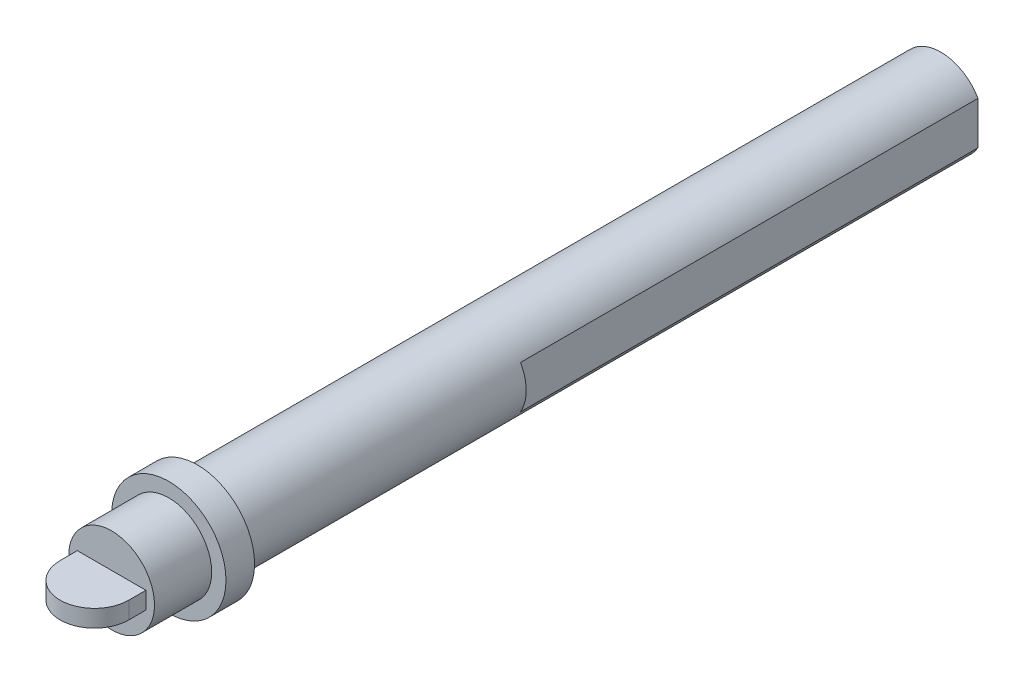
ISO-10303-21;
HEADER;
FILE_DESCRIPTION(('STEP AP214'),'2;1');
FILE_NAME('part.step','',(''),(''),'','','');
FILE_SCHEMA(('AUTOMOTIVE_DESIGN { 1 0 10303 214 1 1 1 1 }'));
ENDSEC;
DATA;
#1=APPLICATION_CONTEXT('core data for automotive mechanical design processes');
#2=APPLICATION_PROTOCOL_DEFINITION('international standard','automotive_design',2000,#1);
#3=PRODUCT_CONTEXT('',#1,'mechanical');
#4=PRODUCT('Part','Part','',(#3));
#5=PRODUCT_RELATED_PRODUCT_CATEGORY('part','',(#4));
#6=PRODUCT_DEFINITION_FORMATION('','',#4);
#7=PRODUCT_DEFINITION_CONTEXT('part definition',#1,'design');
#8=PRODUCT_DEFINITION('design','',#6,#7);
#9=PRODUCT_DEFINITION_SHAPE('','',#8);
#10=(LENGTH_UNIT() NAMED_UNIT(*) SI_UNIT(.MILLI.,.METRE.));
#11=(NAMED_UNIT(*) PLANE_ANGLE_UNIT() SI_UNIT($,.RADIAN.));
#12=(NAMED_UNIT(*) SI_UNIT($,.STERADIAN.) SOLID_ANGLE_UNIT());
#13=UNCERTAINTY_MEASURE_WITH_UNIT(LENGTH_MEASURE(1.E-05),#10,'distance_accuracy_value','');
#14=(GEOMETRIC_REPRESENTATION_CONTEXT(3) GLOBAL_UNCERTAINTY_ASSIGNED_CONTEXT((#13)) GLOBAL_UNIT_ASSIGNED_CONTEXT((#10,
#11,#12)) REPRESENTATION_CONTEXT('',''));
#15=CARTESIAN_POINT('',(0.,0.,0.));
#16=DIRECTION('',(0.,0.,1.));
#17=DIRECTION('',(1.,0.,0.));
#18=AXIS2_PLACEMENT_3D('',#15,#16,#17);
#19=CARTESIAN_POINT('',(0.,-1.5,18.));
#20=DIRECTION('',(0.,-1.,0.));
#21=DIRECTION('',(0.,0.,-1.));
#22=AXIS2_PLACEMENT_3D('',#19,#20,#21);
#23=CYLINDRICAL_SURFACE('',#22,6.);
#24=DIRECTION('',(0.,1.,0.));
#25=VECTOR('',#24,1.);
#26=CARTESIAN_POINT('',(-6.,-1.5,18.));
#27=LINE('',#26,#25);
#28=CARTESIAN_POINT('',(-6.,-1.5,18.));
#29=VERTEX_POINT('',#28);
#30=CARTESIAN_POINT('',(-6.,1.5,18.));
#31=VERTEX_POINT('',#30);
#32=EDGE_CURVE('E140',#29,#31,#27,.T.);
#33=ORIENTED_EDGE('',*,*,#32,.F.);
#34=CARTESIAN_POINT('',(0.,-1.5,18.));
#35=DIRECTION('',(0.,1.,0.));
#36=DIRECTION('',(-1.,0.,0.));
#37=AXIS2_PLACEMENT_3D('',#34,#35,#36);
#38=CIRCLE('',#37,6.);
#39=CARTESIAN_POINT('',(6.,-1.5,18.));
#40=VERTEX_POINT('',#39);
#41=EDGE_CURVE('E151',#40,#29,#38,.F.);
#42=ORIENTED_EDGE('',*,*,#41,.F.);
#43=DIRECTION('',(0.,1.,0.));
#44=VECTOR('',#43,1.);
#45=CARTESIAN_POINT('',(6.,-1.5,18.));
#46=LINE('',#45,#44);
#47=CARTESIAN_POINT('',(6.,1.5,18.));
#48=VERTEX_POINT('',#47);
#49=EDGE_CURVE('E148',#48,#40,#46,.F.);
#50=ORIENTED_EDGE('',*,*,#49,.F.);
#51=CARTESIAN_POINT('',(0.,1.5,18.));
#52=DIRECTION('',(0.,-1.,0.));
#53=DIRECTION('',(1.,0.,0.));
#54=AXIS2_PLACEMENT_3D('',#51,#52,#53);
#55=CIRCLE('',#54,6.);
#56=EDGE_CURVE('E153',#31,#48,#55,.F.);
#57=ORIENTED_EDGE('',*,*,#56,.F.);
#58=EDGE_LOOP('',(#33,#42,#50,#57));
#59=FACE_BOUND('',#58,.T.);
#60=ADVANCED_FACE('F39',(#59),#23,.T.);
#61=CARTESIAN_POINT('',(0.,0.,5.));
#62=DIRECTION('',(0.,0.,-1.));
#63=DIRECTION('',(-1.,0.,0.));
#64=AXIS2_PLACEMENT_3D('',#61,#62,#63);
#65=CYLINDRICAL_SURFACE('',#64,10.);
#66=CARTESIAN_POINT('',(0.,0.,5.));
#67=DIRECTION('',(0.,0.,1.));
#68=DIRECTION('',(1.,0.,0.));
#69=AXIS2_PLACEMENT_3D('',#66,#67,#68);
#70=CIRCLE('',#69,10.);
#71=CARTESIAN_POINT('',(10.,0.,5.));
#72=VERTEX_POINT('',#71);
#73=EDGE_CURVE('E141',#72,#72,#70,.T.);
#74=ORIENTED_EDGE('',*,*,#73,.F.);
#75=EDGE_LOOP('',(#74));
#76=FACE_BOUND('',#75,.T.);
#77=CARTESIAN_POINT('',(0.,0.,0.));
#78=DIRECTION('',(0.,0.,1.));
#79=DIRECTION('',(1.,0.,0.));
#80=AXIS2_PLACEMENT_3D('',#77,#78,#79);
#81=CIRCLE('',#80,10.);
#82=CARTESIAN_POINT('',(10.,0.,0.));
#83=VERTEX_POINT('',#82);
#84=EDGE_CURVE('E131',#83,#83,#81,.T.);
#85=ORIENTED_EDGE('',*,*,#84,.T.);
#86=EDGE_LOOP('',(#85));
#87=FACE_BOUND('',#86,.T.);
#88=ADVANCED_FACE('F169',(#76,#87),#65,.T.);
#89=CARTESIAN_POINT('',(0.,0.,5.));
#90=DIRECTION('',(0.,0.,1.));
#91=DIRECTION('',(1.,0.,0.));
#92=AXIS2_PLACEMENT_3D('',#89,#90,#91);
#93=PLANE('',#92);
#94=CARTESIAN_POINT('',(0.,0.,5.));
#95=DIRECTION('',(0.,0.,1.));
#96=DIRECTION('',(1.,0.,0.));
#97=AXIS2_PLACEMENT_3D('',#94,#95,#96);
#98=CIRCLE('',#97,7.5);
#99=CARTESIAN_POINT('',(7.5,0.,5.));
#100=VERTEX_POINT('',#99);
#101=EDGE_CURVE('E137',#100,#100,#98,.T.);
#102=ORIENTED_EDGE('',*,*,#101,.F.);
#103=EDGE_LOOP('',(#102));
#104=FACE_BOUND('',#103,.T.);
#105=ORIENTED_EDGE('',*,*,#73,.T.);
#106=EDGE_LOOP('',(#105));
#107=FACE_BOUND('',#106,.T.);
#108=ADVANCED_FACE('F174',(#104,#107),#93,.T.);
#109=CARTESIAN_POINT('',(0.,0.,0.));
#110=DIRECTION('',(0.,0.,1.));
#111=DIRECTION('',(1.,0.,0.));
#112=AXIS2_PLACEMENT_3D('',#109,#110,#111);
#113=PLANE('',#112);
#114=CARTESIAN_POINT('',(0.,0.,0.));
#115=DIRECTION('',(0.,0.,1.));
#116=DIRECTION('',(1.,0.,0.));
#117=AXIS2_PLACEMENT_3D('',#114,#115,#116);
#118=CIRCLE('',#117,7.5);
#119=CARTESIAN_POINT('',(7.5,0.,0.));
#120=VERTEX_POINT('',#119);
#121=EDGE_CURVE('E128',#120,#120,#118,.T.);
#122=ORIENTED_EDGE('',*,*,#121,.T.);
#123=EDGE_LOOP('',(#122));
#124=FACE_BOUND('',#123,.T.);
#125=ORIENTED_EDGE('',*,*,#84,.F.);
#126=EDGE_LOOP('',(#125));
#127=FACE_BOUND('',#126,.T.);
#128=ADVANCED_FACE('F239',(#124,#127),#113,.F.);
#129=CARTESIAN_POINT('',(0.,0.,-130.));
#130=DIRECTION('',(0.,0.,1.));
#131=DIRECTION('',(1.,0.,0.));
#132=AXIS2_PLACEMENT_3D('',#129,#130,#131);
#133=PLANE('',#132);
#134=CARTESIAN_POINT('',(0.,0.,-130.));
#135=DIRECTION('',(0.,0.,1.));
#136=DIRECTION('',(1.,0.,0.));
#137=AXIS2_PLACEMENT_3D('',#134,#135,#136);
#138=CIRCLE('',#137,7.5);
#139=CARTESIAN_POINT('',(6.5,3.74165738677394,-130.));
#140=VERTEX_POINT('',#139);
#141=CARTESIAN_POINT('',(-6.5,3.74165738677394,-130.));
#142=VERTEX_POINT('',#141);
#143=EDGE_CURVE('E118',#140,#142,#138,.T.);
#144=ORIENTED_EDGE('',*,*,#143,.F.);
#145=DIRECTION('',(0.,1.,0.));
#146=VECTOR('',#145,1.);
#147=CARTESIAN_POINT('',(6.5,6.98492976173805,-130.));
#148=LINE('',#147,#146);
#149=CARTESIAN_POINT('',(6.5,-3.74165738677394,-130.));
#150=VERTEX_POINT('',#149);
#151=EDGE_CURVE('E121',#150,#140,#148,.T.);
#152=ORIENTED_EDGE('',*,*,#151,.F.);
#153=CARTESIAN_POINT('',(-6.5,-3.74165738677394,-130.));
#154=VERTEX_POINT('',#153);
#155=EDGE_CURVE('E120',#154,#150,#138,.T.);
#156=ORIENTED_EDGE('',*,*,#155,.F.);
#157=DIRECTION('',(0.,-1.,0.));
#158=VECTOR('',#157,1.);
#159=CARTESIAN_POINT('',(-6.5,8.81985001438364,-130.));
#160=LINE('',#159,#158);
#161=EDGE_CURVE('E105',#142,#154,#160,.T.);
#162=ORIENTED_EDGE('',*,*,#161,.F.);
#163=EDGE_LOOP('',(#144,#152,#156,#162));
#164=FACE_BOUND('',#163,.T.);
#165=ADVANCED_FACE('F116',(#164),#133,.F.);
#166=CARTESIAN_POINT('',(0.,0.,-130.));
#167=DIRECTION('',(0.,0.,1.));
#168=DIRECTION('',(1.,0.,0.));
#169=AXIS2_PLACEMENT_3D('',#166,#167,#168);
#170=CYLINDRICAL_SURFACE('',#169,7.5);
#171=DIRECTION('',(0.,0.,1.));
#172=VECTOR('',#171,1.);
#173=CARTESIAN_POINT('',(6.5,-3.74165738677394,-130.));
#174=LINE('',#173,#172);
#175=CARTESIAN_POINT('',(6.5,-3.74165738677394,-50.));
#176=VERTEX_POINT('',#175);
#177=EDGE_CURVE('E11',#176,#150,#174,.F.);
#178=ORIENTED_EDGE('',*,*,#177,.F.);
#179=CARTESIAN_POINT('',(0.,0.,-50.));
#180=DIRECTION('',(0.,0.,-1.));
#181=DIRECTION('',(-1.,0.,0.));
#182=AXIS2_PLACEMENT_3D('',#179,#180,#181);
#183=CIRCLE('',#182,7.5);
#184=CARTESIAN_POINT('',(6.5,3.74165738677394,-50.));
#185=VERTEX_POINT('',#184);
#186=EDGE_CURVE('E110',#176,#185,#183,.F.);
#187=ORIENTED_EDGE('',*,*,#186,.T.);
#188=DIRECTION('',(0.,0.,1.));
#189=VECTOR('',#188,1.);
#190=CARTESIAN_POINT('',(6.5,3.74165738677394,-130.));
#191=LINE('',#190,#189);
#192=EDGE_CURVE('E47',#140,#185,#191,.T.);
#193=ORIENTED_EDGE('',*,*,#192,.F.);
#194=ORIENTED_EDGE('',*,*,#143,.T.);
#195=DIRECTION('',(0.,0.,1.));
#196=VECTOR('',#195,1.);
#197=CARTESIAN_POINT('',(-6.5,3.74165738677394,-130.));
#198=LINE('',#197,#196);
#199=CARTESIAN_POINT('',(-6.5,3.74165738677394,-50.));
#200=VERTEX_POINT('',#199);
#201=EDGE_CURVE('E102',#200,#142,#198,.F.);
#202=ORIENTED_EDGE('',*,*,#201,.F.);
#203=CARTESIAN_POINT('',(0.,0.,-50.));
#204=DIRECTION('',(0.,0.,1.));
#205=DIRECTION('',(1.,0.,0.));
#206=AXIS2_PLACEMENT_3D('',#203,#204,#205);
#207=CIRCLE('',#206,7.5);
#208=CARTESIAN_POINT('',(-6.5,-3.74165738677394,-50.));
#209=VERTEX_POINT('',#208);
#210=EDGE_CURVE('E155',#209,#200,#207,.F.);
#211=ORIENTED_EDGE('',*,*,#210,.F.);
#212=DIRECTION('',(0.,0.,1.));
#213=VECTOR('',#212,1.);
#214=CARTESIAN_POINT('',(-6.5,-3.74165738677394,-130.));
#215=LINE('',#214,#213);
#216=EDGE_CURVE('E111',#154,#209,#215,.T.);
#217=ORIENTED_EDGE('',*,*,#216,.F.);
#218=ORIENTED_EDGE('',*,*,#155,.T.);
#219=EDGE_LOOP('',(#178,#187,#193,#194,#202,#211,#217,#218));
#220=FACE_BOUND('',#219,.T.);
#221=ORIENTED_EDGE('',*,*,#121,.F.);
#222=EDGE_LOOP('',(#221));
#223=FACE_BOUND('',#222,.T.);
#224=ADVANCED_FACE('F125',(#220,#223),#170,.T.);
#225=ORIENTED_EDGE('',*,*,#101,.T.);
#226=EDGE_LOOP('',(#225));
#227=FACE_BOUND('',#226,.T.);
#228=CARTESIAN_POINT('',(0.,0.,15.));
#229=DIRECTION('',(0.,0.,1.));
#230=DIRECTION('',(1.,0.,0.));
#231=AXIS2_PLACEMENT_3D('',#228,#229,#230);
#232=CIRCLE('',#231,7.5);
#233=CARTESIAN_POINT('',(7.5,0.,15.));
#234=VERTEX_POINT('',#233);
#235=EDGE_CURVE('E133',#234,#234,#232,.T.);
#236=ORIENTED_EDGE('',*,*,#235,.F.);
#237=EDGE_LOOP('',(#236));
#238=FACE_BOUND('',#237,.T.);
#239=ADVANCED_FACE('F236',(#227,#238),#170,.T.);
#240=CARTESIAN_POINT('',(0.,0.,15.));
#241=DIRECTION('',(0.,0.,1.));
#242=DIRECTION('',(1.,0.,0.));
#243=AXIS2_PLACEMENT_3D('',#240,#241,#242);
#244=PLANE('',#243);
#245=DIRECTION('',(0.,-1.,0.));
#246=VECTOR('',#245,1.);
#247=CARTESIAN_POINT('',(-6.,-1.5,15.));
#248=LINE('',#247,#246);
#249=CARTESIAN_POINT('',(-6.,1.5,15.));
#250=VERTEX_POINT('',#249);
#251=CARTESIAN_POINT('',(-6.,-1.5,15.));
#252=VERTEX_POINT('',#251);
#253=EDGE_CURVE('E185',#250,#252,#248,.T.);
#254=ORIENTED_EDGE('',*,*,#253,.F.);
#255=DIRECTION('',(-1.,0.,0.));
#256=VECTOR('',#255,1.);
#257=CARTESIAN_POINT('',(6.,1.5,15.));
#258=LINE('',#257,#256);
#259=CARTESIAN_POINT('',(6.,1.5,15.));
#260=VERTEX_POINT('',#259);
#261=EDGE_CURVE('E197',#260,#250,#258,.T.);
#262=ORIENTED_EDGE('',*,*,#261,.F.);
#263=DIRECTION('',(0.,1.,0.));
#264=VECTOR('',#263,1.);
#265=CARTESIAN_POINT('',(6.,-1.5,15.));
#266=LINE('',#265,#264);
#267=CARTESIAN_POINT('',(6.,-1.5,15.));
#268=VERTEX_POINT('',#267);
#269=EDGE_CURVE('E200',#268,#260,#266,.T.);
#270=ORIENTED_EDGE('',*,*,#269,.F.);
#271=DIRECTION('',(1.,0.,0.));
#272=VECTOR('',#271,1.);
#273=CARTESIAN_POINT('',(6.,-1.5,15.));
#274=LINE('',#273,#272);
#275=EDGE_CURVE('E203',#252,#268,#274,.T.);
#276=ORIENTED_EDGE('',*,*,#275,.F.);
#277=EDGE_LOOP('',(#254,#262,#270,#276));
#278=FACE_BOUND('',#277,.T.);
#279=ORIENTED_EDGE('',*,*,#235,.T.);
#280=EDGE_LOOP('',(#279));
#281=FACE_BOUND('',#280,.T.);
#282=ADVANCED_FACE('F212',(#278,#281),#244,.T.);
#283=CARTESIAN_POINT('',(-6.,-1.5,24.));
#284=DIRECTION('',(1.,0.,0.));
#285=DIRECTION('',(0.,0.,-1.));
#286=AXIS2_PLACEMENT_3D('',#283,#284,#285);
#287=PLANE('',#286);
#288=DIRECTION('',(0.,0.,-1.));
#289=VECTOR('',#288,1.);
#290=CARTESIAN_POINT('',(-6.,-1.5,24.));
#291=LINE('',#290,#289);
#292=EDGE_CURVE('E182',#29,#252,#291,.T.);
#293=ORIENTED_EDGE('',*,*,#292,.F.);
#294=ORIENTED_EDGE('',*,*,#32,.T.);
#295=DIRECTION('',(0.,0.,-1.));
#296=VECTOR('',#295,1.);
#297=CARTESIAN_POINT('',(-6.,1.5,24.));
#298=LINE('',#297,#296);
#299=EDGE_CURVE('E195',#31,#250,#298,.T.);
#300=ORIENTED_EDGE('',*,*,#299,.T.);
#301=ORIENTED_EDGE('',*,*,#253,.T.);
#302=EDGE_LOOP('',(#293,#294,#300,#301));
#303=FACE_BOUND('',#302,.T.);
#304=ADVANCED_FACE('F183',(#303),#287,.F.);
#305=CARTESIAN_POINT('',(6.,-1.5,24.));
#306=DIRECTION('',(0.,1.,0.));
#307=DIRECTION('',(-1.,0.,0.));
#308=AXIS2_PLACEMENT_3D('',#305,#306,#307);
#309=PLANE('',#308);
#310=DIRECTION('',(0.,0.,-1.));
#311=VECTOR('',#310,1.);
#312=CARTESIAN_POINT('',(6.,-1.5,24.));
#313=LINE('',#312,#311);
#314=EDGE_CURVE('E189',#40,#268,#313,.T.);
#315=ORIENTED_EDGE('',*,*,#314,.F.);
#316=ORIENTED_EDGE('',*,*,#41,.T.);
#317=ORIENTED_EDGE('',*,*,#292,.T.);
#318=ORIENTED_EDGE('',*,*,#275,.T.);
#319=EDGE_LOOP('',(#315,#316,#317,#318));
#320=FACE_BOUND('',#319,.T.);
#321=ADVANCED_FACE('F209',(#320),#309,.F.);
#322=CARTESIAN_POINT('',(6.,-1.5,24.));
#323=DIRECTION('',(-1.,0.,0.));
#324=DIRECTION('',(0.,0.,1.));
#325=AXIS2_PLACEMENT_3D('',#322,#323,#324);
#326=PLANE('',#325);
#327=DIRECTION('',(0.,0.,-1.));
#328=VECTOR('',#327,1.);
#329=CARTESIAN_POINT('',(6.,1.5,24.));
#330=LINE('',#329,#328);
#331=EDGE_CURVE('E191',#48,#260,#330,.T.);
#332=ORIENTED_EDGE('',*,*,#331,.F.);
#333=ORIENTED_EDGE('',*,*,#49,.T.);
#334=ORIENTED_EDGE('',*,*,#314,.T.);
#335=ORIENTED_EDGE('',*,*,#269,.T.);
#336=EDGE_LOOP('',(#332,#333,#334,#335));
#337=FACE_BOUND('',#336,.T.);
#338=ADVANCED_FACE('F217',(#337),#326,.F.);
#339=CARTESIAN_POINT('',(6.,1.5,24.));
#340=DIRECTION('',(0.,-1.,0.));
#341=DIRECTION('',(1.,0.,0.));
#342=AXIS2_PLACEMENT_3D('',#339,#340,#341);
#343=PLANE('',#342);
#344=ORIENTED_EDGE('',*,*,#299,.F.);
#345=ORIENTED_EDGE('',*,*,#56,.T.);
#346=ORIENTED_EDGE('',*,*,#331,.T.);
#347=ORIENTED_EDGE('',*,*,#261,.T.);
#348=EDGE_LOOP('',(#344,#345,#346,#347));
#349=FACE_BOUND('',#348,.T.);
#350=ADVANCED_FACE('F219',(#349),#343,.F.);
#351=CARTESIAN_POINT('',(-6.5,8.81985001438364,-50.));
#352=DIRECTION('',(1.,0.,0.));
#353=DIRECTION('',(0.,1.,0.));
#354=AXIS2_PLACEMENT_3D('',#351,#352,#353);
#355=PLANE('',#354);
#356=ORIENTED_EDGE('',*,*,#201,.T.);
#357=ORIENTED_EDGE('',*,*,#161,.T.);
#358=ORIENTED_EDGE('',*,*,#216,.T.);
#359=DIRECTION('',(0.,-1.,0.));
#360=VECTOR('',#359,1.);
#361=CARTESIAN_POINT('',(-6.5,8.81985001438364,-50.));
#362=LINE('',#361,#360);
#363=EDGE_CURVE('E60',#200,#209,#362,.T.);
#364=ORIENTED_EDGE('',*,*,#363,.F.);
#365=EDGE_LOOP('',(#356,#357,#358,#364));
#366=FACE_BOUND('',#365,.T.);
#367=ADVANCED_FACE('F104',(#366),#355,.F.);
#368=CARTESIAN_POINT('',(0.,0.,-50.));
#369=DIRECTION('',(0.,0.,1.));
#370=DIRECTION('',(1.,0.,0.));
#371=AXIS2_PLACEMENT_3D('',#368,#369,#370);
#372=PLANE('',#371);
#373=ORIENTED_EDGE('',*,*,#210,.T.);
#374=ORIENTED_EDGE('',*,*,#363,.T.);
#375=EDGE_LOOP('',(#373,#374));
#376=FACE_BOUND('',#375,.T.);
#377=ADVANCED_FACE('F166',(#376),#372,.F.);
#378=CARTESIAN_POINT('',(6.5,6.98492976173805,-50.));
#379=DIRECTION('',(-1.,0.,0.));
#380=DIRECTION('',(0.,-1.,0.));
#381=AXIS2_PLACEMENT_3D('',#378,#379,#380);
#382=PLANE('',#381);
#383=ORIENTED_EDGE('',*,*,#177,.T.);
#384=ORIENTED_EDGE('',*,*,#151,.T.);
#385=ORIENTED_EDGE('',*,*,#192,.T.);
#386=DIRECTION('',(0.,1.,0.));
#387=VECTOR('',#386,1.);
#388=CARTESIAN_POINT('',(6.5,6.98492976173805,-50.));
#389=LINE('',#388,#387);
#390=EDGE_CURVE('E53',#176,#185,#389,.T.);
#391=ORIENTED_EDGE('',*,*,#390,.F.);
#392=EDGE_LOOP('',(#383,#384,#385,#391));
#393=FACE_BOUND('',#392,.T.);
#394=ADVANCED_FACE('F159',(#393),#382,.F.);
#395=CARTESIAN_POINT('',(0.,0.,-50.));
#396=DIRECTION('',(0.,0.,-1.));
#397=DIRECTION('',(-1.,0.,0.));
#398=AXIS2_PLACEMENT_3D('',#395,#396,#397);
#399=PLANE('',#398);
#400=ORIENTED_EDGE('',*,*,#390,.T.);
#401=ORIENTED_EDGE('',*,*,#186,.F.);
#402=EDGE_LOOP('',(#400,#401));
#403=FACE_BOUND('',#402,.T.);
#404=ADVANCED_FACE('F160',(#403),#399,.T.);
#405=CLOSED_SHELL('',(#60,#88,#108,#128,#165,#224,#239,#282,#304,#321,#338,#350,#367,#377,#394,#404));
#406=MANIFOLD_SOLID_BREP('B2',#405);
#407=ADVANCED_BREP_SHAPE_REPRESENTATION('',(#18,#406),#14);
#408=SHAPE_DEFINITION_REPRESENTATION(#9,#407);
ENDSEC;
END-ISO-10303-21;
